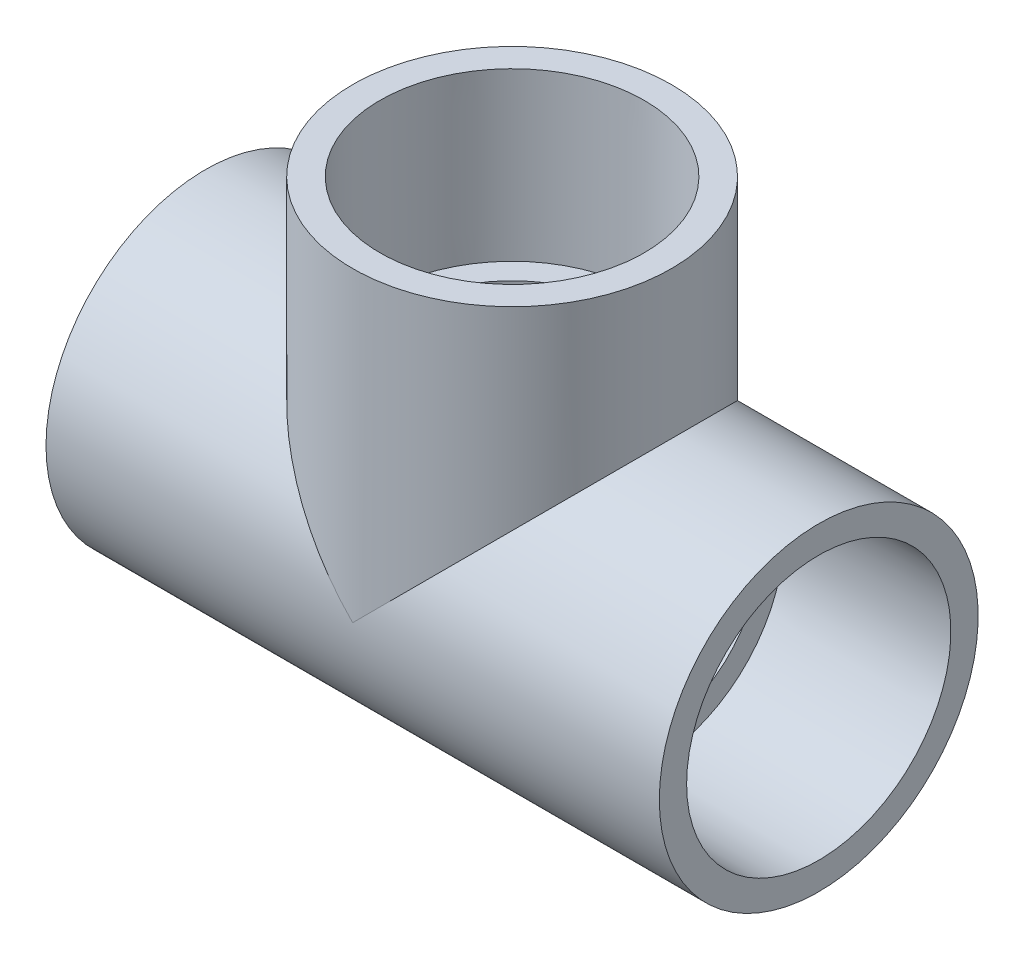
ISO-10303-21;
HEADER;
FILE_DESCRIPTION(('STEP AP214'),'2;1');
FILE_NAME('part.step','',(''),(''),'','','');
FILE_SCHEMA(('AUTOMOTIVE_DESIGN { 1 0 10303 214 1 1 1 1 }'));
ENDSEC;
DATA;
#1=APPLICATION_CONTEXT('core data for automotive mechanical design processes');
#2=APPLICATION_PROTOCOL_DEFINITION('international standard','automotive_design',2000,#1);
#3=PRODUCT_CONTEXT('',#1,'mechanical');
#4=PRODUCT('Part','Part','',(#3));
#5=PRODUCT_RELATED_PRODUCT_CATEGORY('part','',(#4));
#6=PRODUCT_DEFINITION_FORMATION('','',#4);
#7=PRODUCT_DEFINITION_CONTEXT('part definition',#1,'design');
#8=PRODUCT_DEFINITION('design','',#6,#7);
#9=PRODUCT_DEFINITION_SHAPE('','',#8);
#10=(LENGTH_UNIT() NAMED_UNIT(*) SI_UNIT(.MILLI.,.METRE.));
#11=(NAMED_UNIT(*) PLANE_ANGLE_UNIT() SI_UNIT($,.RADIAN.));
#12=(NAMED_UNIT(*) SI_UNIT($,.STERADIAN.) SOLID_ANGLE_UNIT());
#13=UNCERTAINTY_MEASURE_WITH_UNIT(LENGTH_MEASURE(1.E-05),#10,'distance_accuracy_value','');
#14=(GEOMETRIC_REPRESENTATION_CONTEXT(3) GLOBAL_UNCERTAINTY_ASSIGNED_CONTEXT((#13)) GLOBAL_UNIT_ASSIGNED_CONTEXT((#10,
#11,#12)) REPRESENTATION_CONTEXT('',''));
#15=CARTESIAN_POINT('',(0.,0.,0.));
#16=DIRECTION('',(0.,0.,1.));
#17=DIRECTION('',(1.,0.,0.));
#18=AXIS2_PLACEMENT_3D('',#15,#16,#17);
#19=CARTESIAN_POINT('',(-70.358,0.,0.));
#20=DIRECTION('',(-1.,0.,0.));
#21=DIRECTION('',(0.,0.,1.));
#22=AXIS2_PLACEMENT_3D('',#19,#20,#21);
#23=CYLINDRICAL_SURFACE('',#22,36.576);
#24=CARTESIAN_POINT('',(-70.358,0.,0.));
#25=DIRECTION('',(-1.,0.,0.));
#26=DIRECTION('',(0.,0.,1.));
#27=AXIS2_PLACEMENT_3D('',#24,#25,#26);
#28=CIRCLE('',#27,36.576);
#29=CARTESIAN_POINT('',(-70.358,0.,36.576));
#30=VERTEX_POINT('',#29);
#31=EDGE_CURVE('E98',#30,#30,#28,.T.);
#32=ORIENTED_EDGE('',*,*,#31,.F.);
#33=EDGE_LOOP('',(#32));
#34=FACE_BOUND('',#33,.T.);
#35=CARTESIAN_POINT('',(70.358,0.,0.));
#36=DIRECTION('',(-1.,0.,0.));
#37=DIRECTION('',(0.,0.,1.));
#38=AXIS2_PLACEMENT_3D('',#35,#36,#37);
#39=CIRCLE('',#38,36.576);
#40=CARTESIAN_POINT('',(70.358,0.,36.576));
#41=VERTEX_POINT('',#40);
#42=EDGE_CURVE('E76',#41,#41,#39,.T.);
#43=ORIENTED_EDGE('',*,*,#42,.T.);
#44=EDGE_LOOP('',(#43));
#45=FACE_BOUND('',#44,.T.);
#46=CARTESIAN_POINT('',(0.,0.,0.));
#47=DIRECTION('',(-0.707106781186547,-0.707106781186547,0.));
#48=DIRECTION('',(-0.707106781186547,0.707106781186547,0.));
#49=AXIS2_PLACEMENT_3D('',#46,#47,#48);
#50=ELLIPSE('',#49,51.7262752573583,36.576);
#51=CARTESIAN_POINT('',(0.,0.,-36.576));
#52=VERTEX_POINT('',#51);
#53=CARTESIAN_POINT('',(0.,0.,36.576));
#54=VERTEX_POINT('',#53);
#55=EDGE_CURVE('E53',#52,#54,#50,.F.);
#56=ORIENTED_EDGE('',*,*,#55,.F.);
#57=CARTESIAN_POINT('',(0.,0.,0.));
#58=DIRECTION('',(0.707106781186547,-0.707106781186547,0.));
#59=DIRECTION('',(-0.707106781186547,-0.707106781186547,0.));
#60=AXIS2_PLACEMENT_3D('',#57,#58,#59);
#61=ELLIPSE('',#60,51.7262752573583,36.576);
#62=EDGE_CURVE('E89',#52,#54,#61,.T.);
#63=ORIENTED_EDGE('',*,*,#62,.T.);
#64=EDGE_LOOP('',(#56,#63));
#65=FACE_BOUND('',#64,.T.);
#66=ADVANCED_FACE('F34',(#34,#45,#65),#23,.T.);
#67=CARTESIAN_POINT('',(-70.358,-36.576,0.));
#68=DIRECTION('',(-1.,0.,0.));
#69=DIRECTION('',(0.,0.,1.));
#70=AXIS2_PLACEMENT_3D('',#67,#68,#69);
#71=PLANE('',#70);
#72=ORIENTED_EDGE('',*,*,#31,.T.);
#73=EDGE_LOOP('',(#72));
#74=FACE_BOUND('',#73,.T.);
#75=CARTESIAN_POINT('',(-70.358,0.,0.));
#76=DIRECTION('',(-1.,0.,0.));
#77=DIRECTION('',(0.,0.,1.));
#78=AXIS2_PLACEMENT_3D('',#75,#76,#77);
#79=CIRCLE('',#78,30.3149);
#80=CARTESIAN_POINT('',(-70.358,0.,30.3149));
#81=VERTEX_POINT('',#80);
#82=EDGE_CURVE('E106',#81,#81,#79,.T.);
#83=ORIENTED_EDGE('',*,*,#82,.F.);
#84=EDGE_LOOP('',(#83));
#85=FACE_BOUND('',#84,.T.);
#86=ADVANCED_FACE('F36',(#74,#85),#71,.T.);
#87=CARTESIAN_POINT('',(-32.258,0.,0.));
#88=DIRECTION('',(-1.,0.,0.));
#89=DIRECTION('',(0.,0.,1.));
#90=AXIS2_PLACEMENT_3D('',#87,#88,#89);
#91=CONICAL_SURFACE('',#90,30.0863,0.00599992800155504);
#92=ORIENTED_EDGE('',*,*,#82,.T.);
#93=EDGE_LOOP('',(#92));
#94=FACE_BOUND('',#93,.T.);
#95=CARTESIAN_POINT('',(-32.258,0.,0.));
#96=DIRECTION('',(-1.,0.,0.));
#97=DIRECTION('',(0.,0.,1.));
#98=AXIS2_PLACEMENT_3D('',#95,#96,#97);
#99=CIRCLE('',#98,30.0863);
#100=CARTESIAN_POINT('',(-32.258,0.,30.0863));
#101=VERTEX_POINT('',#100);
#102=EDGE_CURVE('E103',#101,#101,#99,.T.);
#103=ORIENTED_EDGE('',*,*,#102,.F.);
#104=EDGE_LOOP('',(#103));
#105=FACE_BOUND('',#104,.T.);
#106=ADVANCED_FACE('F140',(#94,#105),#91,.F.);
#107=CARTESIAN_POINT('',(132.703680146037,32.258,-17.2402207642478));
#108=DIRECTION('',(0.,-1.,0.));
#109=DIRECTION('',(0.,0.,-1.));
#110=AXIS2_PLACEMENT_3D('',#107,#108,#109);
#111=PLANE('',#110);
#112=CARTESIAN_POINT('',(0.,32.258,0.));
#113=DIRECTION('',(0.,1.,0.));
#114=DIRECTION('',(0.,0.,1.));
#115=AXIS2_PLACEMENT_3D('',#112,#113,#114);
#116=CIRCLE('',#115,24.6253);
#117=CARTESIAN_POINT('',(0.,32.258,24.6253));
#118=VERTEX_POINT('',#117);
#119=EDGE_CURVE('E74',#118,#118,#116,.T.);
#120=ORIENTED_EDGE('',*,*,#119,.F.);
#121=EDGE_LOOP('',(#120));
#122=FACE_BOUND('',#121,.T.);
#123=CARTESIAN_POINT('',(0.,32.258,0.));
#124=DIRECTION('',(0.,-1.,0.));
#125=DIRECTION('',(0.,0.,-1.));
#126=AXIS2_PLACEMENT_3D('',#123,#124,#125);
#127=CIRCLE('',#126,30.0863);
#128=CARTESIAN_POINT('',(0.,32.258,-30.0863));
#129=VERTEX_POINT('',#128);
#130=EDGE_CURVE('E60',#129,#129,#127,.F.);
#131=ORIENTED_EDGE('',*,*,#130,.T.);
#132=EDGE_LOOP('',(#131));
#133=FACE_BOUND('',#132,.T.);
#134=ADVANCED_FACE('F112',(#122,#133),#111,.F.);
#135=CARTESIAN_POINT('',(-32.258,0.,0.));
#136=DIRECTION('',(1.,0.,0.));
#137=DIRECTION('',(0.,0.,-1.));
#138=AXIS2_PLACEMENT_3D('',#135,#136,#137);
#139=PLANE('',#138);
#140=CARTESIAN_POINT('',(-32.258,0.,0.));
#141=DIRECTION('',(-1.,0.,0.));
#142=DIRECTION('',(0.,0.,1.));
#143=AXIS2_PLACEMENT_3D('',#140,#141,#142);
#144=CIRCLE('',#143,24.6253);
#145=CARTESIAN_POINT('',(-32.258,0.,24.6253));
#146=VERTEX_POINT('',#145);
#147=EDGE_CURVE('E72',#146,#146,#144,.T.);
#148=ORIENTED_EDGE('',*,*,#147,.F.);
#149=EDGE_LOOP('',(#148));
#150=FACE_BOUND('',#149,.T.);
#151=ORIENTED_EDGE('',*,*,#102,.T.);
#152=EDGE_LOOP('',(#151));
#153=FACE_BOUND('',#152,.T.);
#154=ADVANCED_FACE('F125',(#150,#153),#139,.F.);
#155=CARTESIAN_POINT('',(36.576,70.358,0.));
#156=DIRECTION('',(0.,1.,0.));
#157=DIRECTION('',(0.,0.,1.));
#158=AXIS2_PLACEMENT_3D('',#155,#156,#157);
#159=PLANE('',#158);
#160=CARTESIAN_POINT('',(0.,70.358,0.));
#161=DIRECTION('',(0.,-1.,0.));
#162=DIRECTION('',(0.,0.,-1.));
#163=AXIS2_PLACEMENT_3D('',#160,#161,#162);
#164=CIRCLE('',#163,30.3149);
#165=CARTESIAN_POINT('',(0.,70.358,-30.3149));
#166=VERTEX_POINT('',#165);
#167=EDGE_CURVE('E91',#166,#166,#164,.T.);
#168=ORIENTED_EDGE('',*,*,#167,.T.);
#169=EDGE_LOOP('',(#168));
#170=FACE_BOUND('',#169,.T.);
#171=CARTESIAN_POINT('',(0.,70.358,0.));
#172=DIRECTION('',(0.,-1.,0.));
#173=DIRECTION('',(0.,0.,-1.));
#174=AXIS2_PLACEMENT_3D('',#171,#172,#173);
#175=CIRCLE('',#174,36.576);
#176=CARTESIAN_POINT('',(0.,70.358,-36.576));
#177=VERTEX_POINT('',#176);
#178=EDGE_CURVE('E94',#177,#177,#175,.T.);
#179=ORIENTED_EDGE('',*,*,#178,.F.);
#180=EDGE_LOOP('',(#179));
#181=FACE_BOUND('',#180,.T.);
#182=ADVANCED_FACE('F122',(#170,#181),#159,.T.);
#183=CARTESIAN_POINT('',(0.,0.,0.));
#184=DIRECTION('',(0.,-1.,0.));
#185=DIRECTION('',(0.,0.,-1.));
#186=AXIS2_PLACEMENT_3D('',#183,#184,#185);
#187=CYLINDRICAL_SURFACE('',#186,36.576);
#188=ORIENTED_EDGE('',*,*,#62,.F.);
#189=ORIENTED_EDGE('',*,*,#55,.T.);
#190=EDGE_LOOP('',(#188,#189));
#191=FACE_BOUND('',#190,.T.);
#192=ORIENTED_EDGE('',*,*,#178,.T.);
#193=EDGE_LOOP('',(#192));
#194=FACE_BOUND('',#193,.T.);
#195=ADVANCED_FACE('F118',(#191,#194),#187,.T.);
#196=CARTESIAN_POINT('',(0.,70.358,0.));
#197=DIRECTION('',(0.,1.,0.));
#198=DIRECTION('',(0.,0.,1.));
#199=AXIS2_PLACEMENT_3D('',#196,#197,#198);
#200=CONICAL_SURFACE('',#199,30.3149,0.00599992800155504);
#201=ORIENTED_EDGE('',*,*,#130,.F.);
#202=EDGE_LOOP('',(#201));
#203=FACE_BOUND('',#202,.T.);
#204=ORIENTED_EDGE('',*,*,#167,.F.);
#205=EDGE_LOOP('',(#204));
#206=FACE_BOUND('',#205,.T.);
#207=ADVANCED_FACE('F114',(#203,#206),#200,.F.);
#208=CARTESIAN_POINT('',(70.358,-36.576,0.));
#209=DIRECTION('',(1.,0.,0.));
#210=DIRECTION('',(0.,0.,1.));
#211=AXIS2_PLACEMENT_3D('',#208,#209,#210);
#212=PLANE('',#211);
#213=ORIENTED_EDGE('',*,*,#42,.F.);
#214=EDGE_LOOP('',(#213));
#215=FACE_BOUND('',#214,.T.);
#216=CARTESIAN_POINT('',(70.358,0.,0.));
#217=DIRECTION('',(-1.,0.,0.));
#218=DIRECTION('',(0.,0.,1.));
#219=AXIS2_PLACEMENT_3D('',#216,#217,#218);
#220=CIRCLE('',#219,30.3149);
#221=CARTESIAN_POINT('',(70.358,0.,30.3149));
#222=VERTEX_POINT('',#221);
#223=EDGE_CURVE('E86',#222,#222,#220,.T.);
#224=ORIENTED_EDGE('',*,*,#223,.T.);
#225=EDGE_LOOP('',(#224));
#226=FACE_BOUND('',#225,.T.);
#227=ADVANCED_FACE('F117',(#215,#226),#212,.T.);
#228=CARTESIAN_POINT('',(32.258,0.,0.));
#229=DIRECTION('',(1.,0.,0.));
#230=DIRECTION('',(0.,0.,1.));
#231=AXIS2_PLACEMENT_3D('',#228,#229,#230);
#232=CONICAL_SURFACE('',#231,30.0863,0.00599992800155504);
#233=ORIENTED_EDGE('',*,*,#223,.F.);
#234=EDGE_LOOP('',(#233));
#235=FACE_BOUND('',#234,.T.);
#236=CARTESIAN_POINT('',(32.258,0.,0.));
#237=DIRECTION('',(-1.,0.,0.));
#238=DIRECTION('',(0.,0.,1.));
#239=AXIS2_PLACEMENT_3D('',#236,#237,#238);
#240=CIRCLE('',#239,30.0863);
#241=CARTESIAN_POINT('',(32.258,0.,30.0863));
#242=VERTEX_POINT('',#241);
#243=EDGE_CURVE('E83',#242,#242,#240,.T.);
#244=ORIENTED_EDGE('',*,*,#243,.T.);
#245=EDGE_LOOP('',(#244));
#246=FACE_BOUND('',#245,.T.);
#247=ADVANCED_FACE('F161',(#235,#246),#232,.F.);
#248=CARTESIAN_POINT('',(32.258,-36.576,0.));
#249=DIRECTION('',(-1.,0.,0.));
#250=DIRECTION('',(0.,0.,-1.));
#251=AXIS2_PLACEMENT_3D('',#248,#249,#250);
#252=PLANE('',#251);
#253=CARTESIAN_POINT('',(32.258,0.,0.));
#254=DIRECTION('',(-1.,0.,0.));
#255=DIRECTION('',(0.,0.,1.));
#256=AXIS2_PLACEMENT_3D('',#253,#254,#255);
#257=CIRCLE('',#256,24.6253);
#258=CARTESIAN_POINT('',(32.258,0.,24.6253));
#259=VERTEX_POINT('',#258);
#260=EDGE_CURVE('E69',#259,#259,#257,.F.);
#261=ORIENTED_EDGE('',*,*,#260,.F.);
#262=EDGE_LOOP('',(#261));
#263=FACE_BOUND('',#262,.T.);
#264=ORIENTED_EDGE('',*,*,#243,.F.);
#265=EDGE_LOOP('',(#264));
#266=FACE_BOUND('',#265,.T.);
#267=ADVANCED_FACE('F64',(#263,#266),#252,.F.);
#268=CARTESIAN_POINT('',(101.908866475012,0.,0.));
#269=DIRECTION('',(-1.,0.,0.));
#270=DIRECTION('',(0.,0.,1.));
#271=AXIS2_PLACEMENT_3D('',#268,#269,#270);
#272=CYLINDRICAL_SURFACE('',#271,24.6253);
#273=CARTESIAN_POINT('',(0.,0.,0.));
#274=DIRECTION('',(-0.707106781186547,-0.707106781186547,0.));
#275=DIRECTION('',(-0.707106781186547,0.707106781186547,0.));
#276=AXIS2_PLACEMENT_3D('',#273,#274,#275);
#277=ELLIPSE('',#276,34.8254332375062,24.6253);
#278=CARTESIAN_POINT('',(0.,0.,-24.6253));
#279=VERTEX_POINT('',#278);
#280=CARTESIAN_POINT('',(0.,0.,24.6253));
#281=VERTEX_POINT('',#280);
#282=EDGE_CURVE('E42',#279,#281,#277,.F.);
#283=ORIENTED_EDGE('',*,*,#282,.T.);
#284=CARTESIAN_POINT('',(0.,0.,0.));
#285=DIRECTION('',(-0.707106781186547,0.707106781186547,0.));
#286=DIRECTION('',(-0.707106781186547,-0.707106781186547,0.));
#287=AXIS2_PLACEMENT_3D('',#284,#285,#286);
#288=ELLIPSE('',#287,34.8254332375062,24.6253);
#289=EDGE_CURVE('E11',#281,#279,#288,.T.);
#290=ORIENTED_EDGE('',*,*,#289,.T.);
#291=EDGE_LOOP('',(#283,#290));
#292=FACE_BOUND('',#291,.T.);
#293=ORIENTED_EDGE('',*,*,#260,.T.);
#294=EDGE_LOOP('',(#293));
#295=FACE_BOUND('',#294,.T.);
#296=ORIENTED_EDGE('',*,*,#147,.T.);
#297=EDGE_LOOP('',(#296));
#298=FACE_BOUND('',#297,.T.);
#299=ADVANCED_FACE('F61',(#292,#295,#298),#272,.F.);
#300=CARTESIAN_POINT('',(0.,0.,0.));
#301=DIRECTION('',(0.,1.,0.));
#302=DIRECTION('',(0.,0.,1.));
#303=AXIS2_PLACEMENT_3D('',#300,#301,#302);
#304=CYLINDRICAL_SURFACE('',#303,24.6253);
#305=ORIENTED_EDGE('',*,*,#119,.T.);
#306=EDGE_LOOP('',(#305));
#307=FACE_BOUND('',#306,.T.);
#308=ORIENTED_EDGE('',*,*,#282,.F.);
#309=ORIENTED_EDGE('',*,*,#289,.F.);
#310=EDGE_LOOP('',(#308,#309));
#311=FACE_BOUND('',#310,.T.);
#312=ADVANCED_FACE('F58',(#307,#311),#304,.F.);
#313=CLOSED_SHELL('',(#66,#86,#106,#134,#154,#182,#195,#207,#227,#247,#267,#299,#312));
#314=MANIFOLD_SOLID_BREP('B2',#313);
#315=ADVANCED_BREP_SHAPE_REPRESENTATION('',(#18,#314),#14);
#316=SHAPE_DEFINITION_REPRESENTATION(#9,#315);
ENDSEC;
END-ISO-10303-21;
